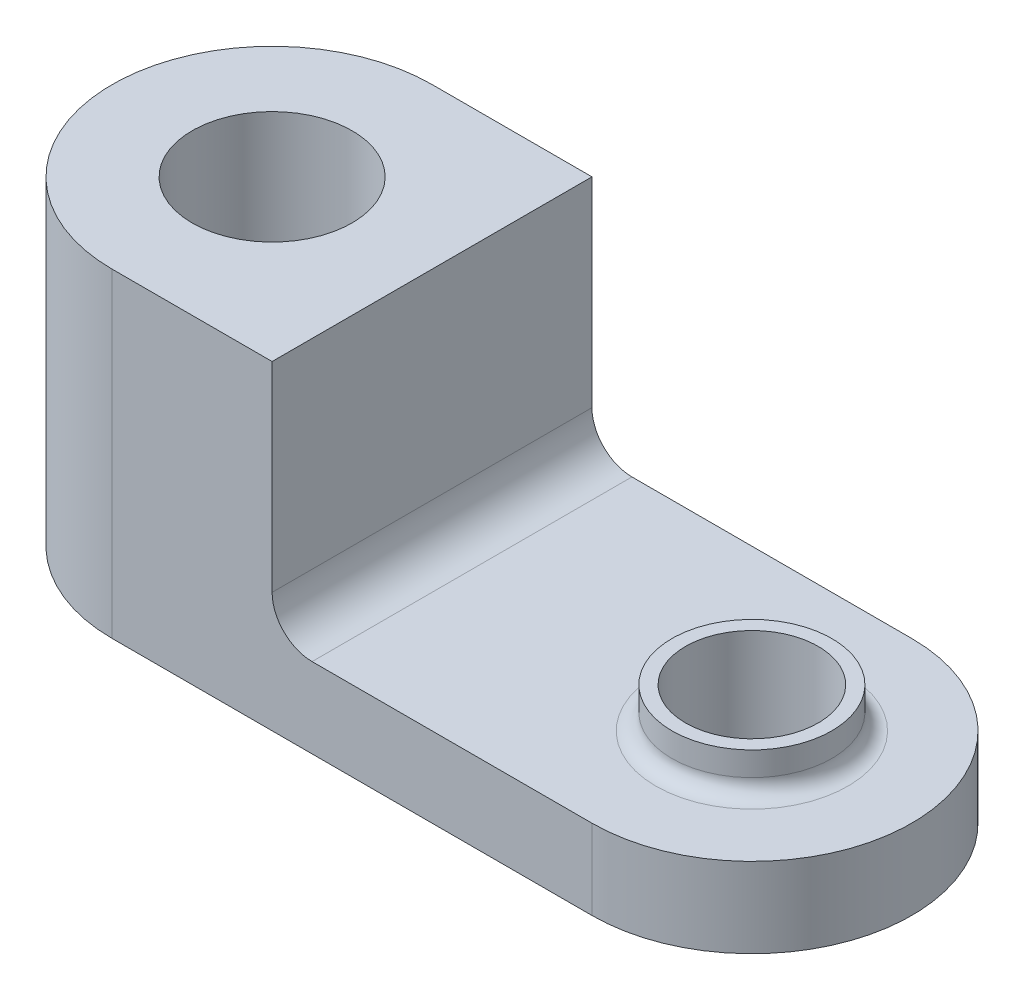
ISO-10303-21;
HEADER;
FILE_DESCRIPTION(('STEP AP214'),'2;1');
FILE_NAME('part.step','',(''),(''),'','','');
FILE_SCHEMA(('AUTOMOTIVE_DESIGN { 1 0 10303 214 1 1 1 1 }'));
ENDSEC;
DATA;
#1=APPLICATION_CONTEXT('core data for automotive mechanical design processes');
#2=APPLICATION_PROTOCOL_DEFINITION('international standard','automotive_design',2000,#1);
#3=PRODUCT_CONTEXT('',#1,'mechanical');
#4=PRODUCT('Part','Part','',(#3));
#5=PRODUCT_RELATED_PRODUCT_CATEGORY('part','',(#4));
#6=PRODUCT_DEFINITION_FORMATION('','',#4);
#7=PRODUCT_DEFINITION_CONTEXT('part definition',#1,'design');
#8=PRODUCT_DEFINITION('design','',#6,#7);
#9=PRODUCT_DEFINITION_SHAPE('','',#8);
#10=(LENGTH_UNIT() NAMED_UNIT(*) SI_UNIT(.MILLI.,.METRE.));
#11=(NAMED_UNIT(*) PLANE_ANGLE_UNIT() SI_UNIT($,.RADIAN.));
#12=(NAMED_UNIT(*) SI_UNIT($,.STERADIAN.) SOLID_ANGLE_UNIT());
#13=UNCERTAINTY_MEASURE_WITH_UNIT(LENGTH_MEASURE(1.E-05),#10,'distance_accuracy_value','');
#14=(GEOMETRIC_REPRESENTATION_CONTEXT(3) GLOBAL_UNCERTAINTY_ASSIGNED_CONTEXT((#13)) GLOBAL_UNIT_ASSIGNED_CONTEXT((#10,
#11,#12)) REPRESENTATION_CONTEXT('',''));
#15=CARTESIAN_POINT('',(0.,0.,0.));
#16=DIRECTION('',(0.,0.,1.));
#17=DIRECTION('',(1.,0.,0.));
#18=AXIS2_PLACEMENT_3D('',#15,#16,#17);
#19=CARTESIAN_POINT('',(-30.,10.,0.));
#20=DIRECTION('',(0.,1.,0.));
#21=DIRECTION('',(0.,0.,1.));
#22=AXIS2_PLACEMENT_3D('',#19,#20,#21);
#23=PLANE('',#22);
#24=CARTESIAN_POINT('',(30.,10.,0.));
#25=DIRECTION('',(0.,1.,0.));
#26=DIRECTION('',(0.,0.,1.));
#27=AXIS2_PLACEMENT_3D('',#24,#25,#26);
#28=CIRCLE('',#27,12.);
#29=CARTESIAN_POINT('',(30.,10.,12.));
#30=VERTEX_POINT('',#29);
#31=EDGE_CURVE('E197',#30,#30,#28,.F.);
#32=ORIENTED_EDGE('',*,*,#31,.T.);
#33=EDGE_LOOP('',(#32));
#34=FACE_BOUND('',#33,.T.);
#35=DIRECTION('',(1.,0.,0.));
#36=VECTOR('',#35,1.);
#37=CARTESIAN_POINT('',(-30.,10.,-20.));
#38=LINE('',#37,#36);
#39=CARTESIAN_POINT('',(-5.,10.,-20.));
#40=VERTEX_POINT('',#39);
#41=CARTESIAN_POINT('',(30.,10.,-20.));
#42=VERTEX_POINT('',#41);
#43=EDGE_CURVE('E174',#40,#42,#38,.T.);
#44=ORIENTED_EDGE('',*,*,#43,.F.);
#45=DIRECTION('',(0.,0.,-1.));
#46=VECTOR('',#45,1.);
#47=CARTESIAN_POINT('',(-5.,10.,0.));
#48=LINE('',#47,#46);
#49=CARTESIAN_POINT('',(-5.,10.,20.));
#50=VERTEX_POINT('',#49);
#51=EDGE_CURVE('E98',#40,#50,#48,.F.);
#52=ORIENTED_EDGE('',*,*,#51,.T.);
#53=DIRECTION('',(1.,0.,0.));
#54=VECTOR('',#53,1.);
#55=CARTESIAN_POINT('',(-30.,10.,20.));
#56=LINE('',#55,#54);
#57=CARTESIAN_POINT('',(30.,10.,20.));
#58=VERTEX_POINT('',#57);
#59=EDGE_CURVE('E168',#50,#58,#56,.T.);
#60=ORIENTED_EDGE('',*,*,#59,.T.);
#61=CARTESIAN_POINT('',(30.,10.,0.));
#62=DIRECTION('',(0.,1.,0.));
#63=DIRECTION('',(0.,0.,1.));
#64=AXIS2_PLACEMENT_3D('',#61,#62,#63);
#65=CIRCLE('',#64,20.);
#66=EDGE_CURVE('E170',#58,#42,#65,.T.);
#67=ORIENTED_EDGE('',*,*,#66,.T.);
#68=EDGE_LOOP('',(#44,#52,#60,#67));
#69=FACE_BOUND('',#68,.T.);
#70=ADVANCED_FACE('F77',(#34,#69),#23,.T.);
#71=CARTESIAN_POINT('',(-30.,0.,0.));
#72=DIRECTION('',(0.,1.,0.));
#73=DIRECTION('',(0.,0.,1.));
#74=AXIS2_PLACEMENT_3D('',#71,#72,#73);
#75=PLANE('',#74);
#76=CARTESIAN_POINT('',(-30.,0.,0.));
#77=DIRECTION('',(0.,1.,0.));
#78=DIRECTION('',(0.,0.,1.));
#79=AXIS2_PLACEMENT_3D('',#76,#77,#78);
#80=CIRCLE('',#79,20.);
#81=CARTESIAN_POINT('',(-30.,0.,-20.));
#82=VERTEX_POINT('',#81);
#83=CARTESIAN_POINT('',(-30.,0.,20.));
#84=VERTEX_POINT('',#83);
#85=EDGE_CURVE('E163',#82,#84,#80,.T.);
#86=ORIENTED_EDGE('',*,*,#85,.F.);
#87=DIRECTION('',(1.,0.,0.));
#88=VECTOR('',#87,1.);
#89=CARTESIAN_POINT('',(-30.,0.,-20.));
#90=LINE('',#89,#88);
#91=CARTESIAN_POINT('',(30.,0.,-20.));
#92=VERTEX_POINT('',#91);
#93=EDGE_CURVE('E171',#82,#92,#90,.T.);
#94=ORIENTED_EDGE('',*,*,#93,.T.);
#95=CARTESIAN_POINT('',(30.,0.,0.));
#96=DIRECTION('',(0.,1.,0.));
#97=DIRECTION('',(0.,0.,1.));
#98=AXIS2_PLACEMENT_3D('',#95,#96,#97);
#99=CIRCLE('',#98,20.);
#100=CARTESIAN_POINT('',(30.,0.,20.));
#101=VERTEX_POINT('',#100);
#102=EDGE_CURVE('E180',#101,#92,#99,.T.);
#103=ORIENTED_EDGE('',*,*,#102,.F.);
#104=DIRECTION('',(1.,0.,0.));
#105=VECTOR('',#104,1.);
#106=CARTESIAN_POINT('',(-30.,0.,20.));
#107=LINE('',#106,#105);
#108=EDGE_CURVE('E178',#84,#101,#107,.T.);
#109=ORIENTED_EDGE('',*,*,#108,.F.);
#110=EDGE_LOOP('',(#86,#94,#103,#109));
#111=FACE_BOUND('',#110,.T.);
#112=CARTESIAN_POINT('',(-30.,0.,0.));
#113=DIRECTION('',(0.,1.,0.));
#114=DIRECTION('',(0.,0.,1.));
#115=AXIS2_PLACEMENT_3D('',#112,#113,#114);
#116=CIRCLE('',#115,10.);
#117=CARTESIAN_POINT('',(-30.,0.,10.));
#118=VERTEX_POINT('',#117);
#119=EDGE_CURVE('E159',#118,#118,#116,.T.);
#120=ORIENTED_EDGE('',*,*,#119,.T.);
#121=EDGE_LOOP('',(#120));
#122=FACE_BOUND('',#121,.T.);
#123=CARTESIAN_POINT('',(30.,0.,0.));
#124=DIRECTION('',(0.,1.,0.));
#125=DIRECTION('',(0.,0.,1.));
#126=AXIS2_PLACEMENT_3D('',#123,#124,#125);
#127=CIRCLE('',#126,8.29938246122922);
#128=CARTESIAN_POINT('',(30.,0.,8.29938246122922));
#129=VERTEX_POINT('',#128);
#130=EDGE_CURVE('E224',#129,#129,#127,.T.);
#131=ORIENTED_EDGE('',*,*,#130,.T.);
#132=EDGE_LOOP('',(#131));
#133=FACE_BOUND('',#132,.T.);
#134=ADVANCED_FACE('F238',(#111,#122,#133),#75,.F.);
#135=CARTESIAN_POINT('',(-30.,10.,0.));
#136=DIRECTION('',(0.,-1.,0.));
#137=DIRECTION('',(0.,0.,-1.));
#138=AXIS2_PLACEMENT_3D('',#135,#136,#137);
#139=CYLINDRICAL_SURFACE('',#138,20.);
#140=ORIENTED_EDGE('',*,*,#85,.T.);
#141=DIRECTION('',(0.,-1.,0.));
#142=VECTOR('',#141,1.);
#143=CARTESIAN_POINT('',(-30.,10.,20.));
#144=LINE('',#143,#142);
#145=CARTESIAN_POINT('',(-30.,40.,20.));
#146=VERTEX_POINT('',#145);
#147=EDGE_CURVE('E191',#146,#84,#144,.T.);
#148=ORIENTED_EDGE('',*,*,#147,.F.);
#149=CARTESIAN_POINT('',(-30.,40.,0.));
#150=DIRECTION('',(0.,1.,0.));
#151=DIRECTION('',(0.,0.,1.));
#152=AXIS2_PLACEMENT_3D('',#149,#150,#151);
#153=CIRCLE('',#152,20.);
#154=CARTESIAN_POINT('',(-30.,40.,-20.));
#155=VERTEX_POINT('',#154);
#156=EDGE_CURVE('E142',#155,#146,#153,.T.);
#157=ORIENTED_EDGE('',*,*,#156,.F.);
#158=DIRECTION('',(0.,-1.,0.));
#159=VECTOR('',#158,1.);
#160=CARTESIAN_POINT('',(-30.,10.,-20.));
#161=LINE('',#160,#159);
#162=EDGE_CURVE('E138',#155,#82,#161,.T.);
#163=ORIENTED_EDGE('',*,*,#162,.T.);
#164=EDGE_LOOP('',(#140,#148,#157,#163));
#165=FACE_BOUND('',#164,.T.);
#166=ADVANCED_FACE('F244',(#165),#139,.T.);
#167=CARTESIAN_POINT('',(-30.,10.,20.));
#168=DIRECTION('',(0.,0.,-1.));
#169=DIRECTION('',(-1.,0.,0.));
#170=AXIS2_PLACEMENT_3D('',#167,#168,#169);
#171=PLANE('',#170);
#172=ORIENTED_EDGE('',*,*,#108,.T.);
#173=DIRECTION('',(0.,-1.,0.));
#174=VECTOR('',#173,1.);
#175=CARTESIAN_POINT('',(30.,10.,20.));
#176=LINE('',#175,#174);
#177=EDGE_CURVE('E188',#58,#101,#176,.T.);
#178=ORIENTED_EDGE('',*,*,#177,.F.);
#179=ORIENTED_EDGE('',*,*,#59,.F.);
#180=CARTESIAN_POINT('',(-5.,15.,20.));
#181=DIRECTION('',(0.,0.,-1.));
#182=DIRECTION('',(-1.,0.,0.));
#183=AXIS2_PLACEMENT_3D('',#180,#181,#182);
#184=CIRCLE('',#183,5.);
#185=CARTESIAN_POINT('',(-10.,15.,20.));
#186=VERTEX_POINT('',#185);
#187=EDGE_CURVE('E12',#50,#186,#184,.T.);
#188=ORIENTED_EDGE('',*,*,#187,.T.);
#189=DIRECTION('',(0.,-1.,0.));
#190=VECTOR('',#189,1.);
#191=CARTESIAN_POINT('',(-10.,40.,20.));
#192=LINE('',#191,#190);
#193=CARTESIAN_POINT('',(-10.,40.,20.));
#194=VERTEX_POINT('',#193);
#195=EDGE_CURVE('E160',#194,#186,#192,.T.);
#196=ORIENTED_EDGE('',*,*,#195,.F.);
#197=DIRECTION('',(1.,0.,0.));
#198=VECTOR('',#197,1.);
#199=CARTESIAN_POINT('',(-10.,40.,20.));
#200=LINE('',#199,#198);
#201=EDGE_CURVE('E149',#146,#194,#200,.T.);
#202=ORIENTED_EDGE('',*,*,#201,.F.);
#203=ORIENTED_EDGE('',*,*,#147,.T.);
#204=EDGE_LOOP('',(#172,#178,#179,#188,#196,#202,#203));
#205=FACE_BOUND('',#204,.T.);
#206=ADVANCED_FACE('F230',(#205),#171,.F.);
#207=CARTESIAN_POINT('',(30.,10.,0.));
#208=DIRECTION('',(0.,-1.,0.));
#209=DIRECTION('',(0.,0.,-1.));
#210=AXIS2_PLACEMENT_3D('',#207,#208,#209);
#211=CYLINDRICAL_SURFACE('',#210,20.);
#212=ORIENTED_EDGE('',*,*,#102,.T.);
#213=DIRECTION('',(0.,-1.,0.));
#214=VECTOR('',#213,1.);
#215=CARTESIAN_POINT('',(30.,10.,-20.));
#216=LINE('',#215,#214);
#217=EDGE_CURVE('E186',#42,#92,#216,.T.);
#218=ORIENTED_EDGE('',*,*,#217,.F.);
#219=ORIENTED_EDGE('',*,*,#66,.F.);
#220=ORIENTED_EDGE('',*,*,#177,.T.);
#221=EDGE_LOOP('',(#212,#218,#219,#220));
#222=FACE_BOUND('',#221,.T.);
#223=ADVANCED_FACE('F253',(#222),#211,.T.);
#224=CARTESIAN_POINT('',(-30.,10.,-20.));
#225=DIRECTION('',(0.,0.,-1.));
#226=DIRECTION('',(-1.,0.,0.));
#227=AXIS2_PLACEMENT_3D('',#224,#225,#226);
#228=PLANE('',#227);
#229=ORIENTED_EDGE('',*,*,#93,.F.);
#230=ORIENTED_EDGE('',*,*,#162,.F.);
#231=DIRECTION('',(-1.,0.,0.));
#232=VECTOR('',#231,1.);
#233=CARTESIAN_POINT('',(-10.,40.,-20.));
#234=LINE('',#233,#232);
#235=CARTESIAN_POINT('',(-10.,40.,-20.));
#236=VERTEX_POINT('',#235);
#237=EDGE_CURVE('E132',#236,#155,#234,.T.);
#238=ORIENTED_EDGE('',*,*,#237,.F.);
#239=DIRECTION('',(0.,-1.,0.));
#240=VECTOR('',#239,1.);
#241=CARTESIAN_POINT('',(-10.,40.,-20.));
#242=LINE('',#241,#240);
#243=CARTESIAN_POINT('',(-10.,15.,-20.));
#244=VERTEX_POINT('',#243);
#245=EDGE_CURVE('E137',#236,#244,#242,.T.);
#246=ORIENTED_EDGE('',*,*,#245,.T.);
#247=CARTESIAN_POINT('',(-5.,15.,-20.));
#248=DIRECTION('',(0.,0.,-1.));
#249=DIRECTION('',(-1.,0.,0.));
#250=AXIS2_PLACEMENT_3D('',#247,#248,#249);
#251=CIRCLE('',#250,5.);
#252=EDGE_CURVE('E85',#244,#40,#251,.F.);
#253=ORIENTED_EDGE('',*,*,#252,.T.);
#254=ORIENTED_EDGE('',*,*,#43,.T.);
#255=ORIENTED_EDGE('',*,*,#217,.T.);
#256=EDGE_LOOP('',(#229,#230,#238,#246,#253,#254,#255));
#257=FACE_BOUND('',#256,.T.);
#258=ADVANCED_FACE('F135',(#257),#228,.T.);
#259=CARTESIAN_POINT('',(-30.,10.,0.));
#260=DIRECTION('',(0.,-1.,0.));
#261=DIRECTION('',(0.,0.,-1.));
#262=AXIS2_PLACEMENT_3D('',#259,#260,#261);
#263=CYLINDRICAL_SURFACE('',#262,10.);
#264=ORIENTED_EDGE('',*,*,#119,.F.);
#265=EDGE_LOOP('',(#264));
#266=FACE_BOUND('',#265,.T.);
#267=CARTESIAN_POINT('',(-30.,40.,0.));
#268=DIRECTION('',(0.,1.,0.));
#269=DIRECTION('',(0.,0.,1.));
#270=AXIS2_PLACEMENT_3D('',#267,#268,#269);
#271=CIRCLE('',#270,10.);
#272=CARTESIAN_POINT('',(-30.,40.,10.));
#273=VERTEX_POINT('',#272);
#274=EDGE_CURVE('E153',#273,#273,#271,.T.);
#275=ORIENTED_EDGE('',*,*,#274,.T.);
#276=EDGE_LOOP('',(#275));
#277=FACE_BOUND('',#276,.T.);
#278=ADVANCED_FACE('F248',(#266,#277),#263,.F.);
#279=CARTESIAN_POINT('',(-30.,40.,0.));
#280=DIRECTION('',(0.,1.,0.));
#281=DIRECTION('',(0.,0.,1.));
#282=AXIS2_PLACEMENT_3D('',#279,#280,#281);
#283=PLANE('',#282);
#284=DIRECTION('',(0.,0.,-1.));
#285=VECTOR('',#284,1.);
#286=CARTESIAN_POINT('',(-10.,40.,-20.));
#287=LINE('',#286,#285);
#288=EDGE_CURVE('E143',#194,#236,#287,.T.);
#289=ORIENTED_EDGE('',*,*,#288,.T.);
#290=ORIENTED_EDGE('',*,*,#237,.T.);
#291=ORIENTED_EDGE('',*,*,#156,.T.);
#292=ORIENTED_EDGE('',*,*,#201,.T.);
#293=EDGE_LOOP('',(#289,#290,#291,#292));
#294=FACE_BOUND('',#293,.T.);
#295=ORIENTED_EDGE('',*,*,#274,.F.);
#296=EDGE_LOOP('',(#295));
#297=FACE_BOUND('',#296,.T.);
#298=ADVANCED_FACE('F146',(#294,#297),#283,.T.);
#299=CARTESIAN_POINT('',(-10.,40.,-20.));
#300=DIRECTION('',(-1.,0.,0.));
#301=DIRECTION('',(0.,0.,1.));
#302=AXIS2_PLACEMENT_3D('',#299,#300,#301);
#303=PLANE('',#302);
#304=ORIENTED_EDGE('',*,*,#195,.T.);
#305=DIRECTION('',(0.,0.,-1.));
#306=VECTOR('',#305,1.);
#307=CARTESIAN_POINT('',(-10.,15.,-20.));
#308=LINE('',#307,#306);
#309=EDGE_CURVE('E158',#186,#244,#308,.T.);
#310=ORIENTED_EDGE('',*,*,#309,.T.);
#311=ORIENTED_EDGE('',*,*,#245,.F.);
#312=ORIENTED_EDGE('',*,*,#288,.F.);
#313=EDGE_LOOP('',(#304,#310,#311,#312));
#314=FACE_BOUND('',#313,.T.);
#315=ADVANCED_FACE('F156',(#314),#303,.F.);
#316=CARTESIAN_POINT('',(30.,15.,0.));
#317=DIRECTION('',(0.,1.,0.));
#318=DIRECTION('',(0.,0.,1.));
#319=AXIS2_PLACEMENT_3D('',#316,#317,#318);
#320=PLANE('',#319);
#321=CARTESIAN_POINT('',(30.,15.,0.));
#322=DIRECTION('',(0.,1.,0.));
#323=DIRECTION('',(0.,0.,1.));
#324=AXIS2_PLACEMENT_3D('',#321,#322,#323);
#325=CIRCLE('',#324,10.);
#326=CARTESIAN_POINT('',(30.,15.,10.));
#327=VERTEX_POINT('',#326);
#328=EDGE_CURVE('E217',#327,#327,#325,.T.);
#329=ORIENTED_EDGE('',*,*,#328,.T.);
#330=EDGE_LOOP('',(#329));
#331=FACE_BOUND('',#330,.T.);
#332=CARTESIAN_POINT('',(30.,15.,0.));
#333=DIRECTION('',(0.,1.,0.));
#334=DIRECTION('',(0.,0.,1.));
#335=AXIS2_PLACEMENT_3D('',#332,#333,#334);
#336=CIRCLE('',#335,8.29938246122922);
#337=CARTESIAN_POINT('',(30.,15.,8.29938246122922));
#338=VERTEX_POINT('',#337);
#339=EDGE_CURVE('E219',#338,#338,#336,.T.);
#340=ORIENTED_EDGE('',*,*,#339,.F.);
#341=EDGE_LOOP('',(#340));
#342=FACE_BOUND('',#341,.T.);
#343=ADVANCED_FACE('F213',(#331,#342),#320,.T.);
#344=CARTESIAN_POINT('',(30.,15.,0.));
#345=DIRECTION('',(0.,-1.,0.));
#346=DIRECTION('',(0.,0.,-1.));
#347=AXIS2_PLACEMENT_3D('',#344,#345,#346);
#348=CYLINDRICAL_SURFACE('',#347,10.);
#349=CARTESIAN_POINT('',(30.,12.,0.));
#350=DIRECTION('',(0.,1.,0.));
#351=DIRECTION('',(0.,0.,1.));
#352=AXIS2_PLACEMENT_3D('',#349,#350,#351);
#353=CIRCLE('',#352,10.);
#354=CARTESIAN_POINT('',(30.,12.,10.));
#355=VERTEX_POINT('',#354);
#356=EDGE_CURVE('E194',#355,#355,#353,.T.);
#357=ORIENTED_EDGE('',*,*,#356,.T.);
#358=EDGE_LOOP('',(#357));
#359=FACE_BOUND('',#358,.T.);
#360=ORIENTED_EDGE('',*,*,#328,.F.);
#361=EDGE_LOOP('',(#360));
#362=FACE_BOUND('',#361,.T.);
#363=ADVANCED_FACE('F210',(#359,#362),#348,.T.);
#364=CARTESIAN_POINT('',(30.,15.,0.));
#365=DIRECTION('',(0.,-1.,0.));
#366=DIRECTION('',(0.,0.,-1.));
#367=AXIS2_PLACEMENT_3D('',#364,#365,#366);
#368=CYLINDRICAL_SURFACE('',#367,8.29938246122922);
#369=ORIENTED_EDGE('',*,*,#339,.T.);
#370=EDGE_LOOP('',(#369));
#371=FACE_BOUND('',#370,.T.);
#372=ORIENTED_EDGE('',*,*,#130,.F.);
#373=EDGE_LOOP('',(#372));
#374=FACE_BOUND('',#373,.T.);
#375=ADVANCED_FACE('F207',(#371,#374),#368,.F.);
#376=CARTESIAN_POINT('',(30.,12.,0.));
#377=DIRECTION('',(0.,1.,0.));
#378=DIRECTION('',(0.,0.,1.));
#379=AXIS2_PLACEMENT_3D('',#376,#377,#378);
#380=TOROIDAL_SURFACE('',#379,12.,2.);
#381=ORIENTED_EDGE('',*,*,#31,.F.);
#382=EDGE_LOOP('',(#381));
#383=FACE_BOUND('',#382,.T.);
#384=ORIENTED_EDGE('',*,*,#356,.F.);
#385=EDGE_LOOP('',(#384));
#386=FACE_BOUND('',#385,.T.);
#387=ADVANCED_FACE('F204',(#383,#386),#380,.F.);
#388=CARTESIAN_POINT('',(-5.,15.,-20.));
#389=DIRECTION('',(0.,0.,-1.));
#390=DIRECTION('',(-1.,0.,0.));
#391=AXIS2_PLACEMENT_3D('',#388,#389,#390);
#392=CYLINDRICAL_SURFACE('',#391,5.);
#393=ORIENTED_EDGE('',*,*,#187,.F.);
#394=ORIENTED_EDGE('',*,*,#51,.F.);
#395=ORIENTED_EDGE('',*,*,#252,.F.);
#396=ORIENTED_EDGE('',*,*,#309,.F.);
#397=EDGE_LOOP('',(#393,#394,#395,#396));
#398=FACE_BOUND('',#397,.T.);
#399=ADVANCED_FACE('F79',(#398),#392,.F.);
#400=CLOSED_SHELL('',(#70,#134,#166,#206,#223,#258,#278,#298,#315,#343,#363,#375,#387,#399));
#401=MANIFOLD_SOLID_BREP('B2',#400);
#402=ADVANCED_BREP_SHAPE_REPRESENTATION('',(#18,#401),#14);
#403=SHAPE_DEFINITION_REPRESENTATION(#9,#402);
ENDSEC;
END-ISO-10303-21;
